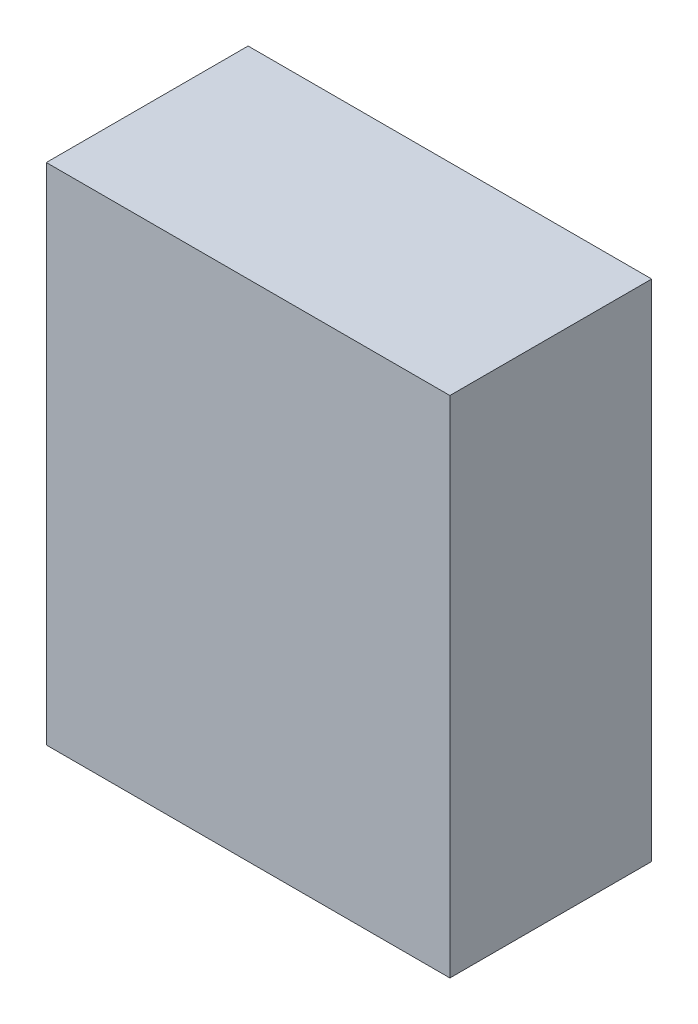
ISO-10303-21;
HEADER;
FILE_DESCRIPTION(('STEP AP214'),'2;1');
FILE_NAME('part.step','',(''),(''),'','','');
FILE_SCHEMA(('AUTOMOTIVE_DESIGN { 1 0 10303 214 1 1 1 1 }'));
ENDSEC;
DATA;
#1=APPLICATION_CONTEXT('core data for automotive mechanical design processes');
#2=APPLICATION_PROTOCOL_DEFINITION('international standard','automotive_design',2000,#1);
#3=PRODUCT_CONTEXT('',#1,'mechanical');
#4=PRODUCT('Part','Part','',(#3));
#5=PRODUCT_RELATED_PRODUCT_CATEGORY('part','',(#4));
#6=PRODUCT_DEFINITION_FORMATION('','',#4);
#7=PRODUCT_DEFINITION_CONTEXT('part definition',#1,'design');
#8=PRODUCT_DEFINITION('design','',#6,#7);
#9=PRODUCT_DEFINITION_SHAPE('','',#8);
#10=(LENGTH_UNIT() NAMED_UNIT(*) SI_UNIT(.MILLI.,.METRE.));
#11=(NAMED_UNIT(*) PLANE_ANGLE_UNIT() SI_UNIT($,.RADIAN.));
#12=(NAMED_UNIT(*) SI_UNIT($,.STERADIAN.) SOLID_ANGLE_UNIT());
#13=UNCERTAINTY_MEASURE_WITH_UNIT(LENGTH_MEASURE(1.E-05),#10,'distance_accuracy_value','');
#14=(GEOMETRIC_REPRESENTATION_CONTEXT(3) GLOBAL_UNCERTAINTY_ASSIGNED_CONTEXT((#13)) GLOBAL_UNIT_ASSIGNED_CONTEXT((#10,
#11,#12)) REPRESENTATION_CONTEXT('',''));
#15=CARTESIAN_POINT('',(0.,0.,0.));
#16=DIRECTION('',(0.,0.,1.));
#17=DIRECTION('',(1.,0.,0.));
#18=AXIS2_PLACEMENT_3D('',#15,#16,#17);
#19=CARTESIAN_POINT('',(400.,-500.,400.));
#20=DIRECTION('',(-1.,0.,0.));
#21=DIRECTION('',(0.,0.,1.));
#22=AXIS2_PLACEMENT_3D('',#19,#20,#21);
#23=PLANE('',#22);
#24=DIRECTION('',(0.,1.,0.));
#25=VECTOR('',#24,1.);
#26=CARTESIAN_POINT('',(400.,-500.,0.));
#27=LINE('',#26,#25);
#28=CARTESIAN_POINT('',(400.,-500.,0.));
#29=VERTEX_POINT('',#28);
#30=CARTESIAN_POINT('',(400.,500.,0.));
#31=VERTEX_POINT('',#30);
#32=EDGE_CURVE('E99',#29,#31,#27,.T.);
#33=ORIENTED_EDGE('',*,*,#32,.T.);
#34=DIRECTION('',(0.,0.,-1.));
#35=VECTOR('',#34,1.);
#36=CARTESIAN_POINT('',(400.,500.,400.));
#37=LINE('',#36,#35);
#38=CARTESIAN_POINT('',(400.,500.,400.));
#39=VERTEX_POINT('',#38);
#40=EDGE_CURVE('E11',#39,#31,#37,.T.);
#41=ORIENTED_EDGE('',*,*,#40,.F.);
#42=DIRECTION('',(0.,1.,0.));
#43=VECTOR('',#42,1.);
#44=CARTESIAN_POINT('',(400.,-500.,400.));
#45=LINE('',#44,#43);
#46=CARTESIAN_POINT('',(400.,-500.,400.));
#47=VERTEX_POINT('',#46);
#48=EDGE_CURVE('E87',#47,#39,#45,.T.);
#49=ORIENTED_EDGE('',*,*,#48,.F.);
#50=DIRECTION('',(0.,0.,-1.));
#51=VECTOR('',#50,1.);
#52=CARTESIAN_POINT('',(400.,-500.,400.));
#53=LINE('',#52,#51);
#54=EDGE_CURVE('E95',#47,#29,#53,.T.);
#55=ORIENTED_EDGE('',*,*,#54,.T.);
#56=EDGE_LOOP('',(#33,#41,#49,#55));
#57=FACE_BOUND('',#56,.T.);
#58=ADVANCED_FACE('F36',(#57),#23,.F.);
#59=CARTESIAN_POINT('',(-400.,500.,400.));
#60=DIRECTION('',(0.,-1.,0.));
#61=DIRECTION('',(0.,0.,-1.));
#62=AXIS2_PLACEMENT_3D('',#59,#60,#61);
#63=PLANE('',#62);
#64=DIRECTION('',(-1.,0.,0.));
#65=VECTOR('',#64,1.);
#66=CARTESIAN_POINT('',(-400.,500.,0.));
#67=LINE('',#66,#65);
#68=CARTESIAN_POINT('',(-400.,500.,0.));
#69=VERTEX_POINT('',#68);
#70=EDGE_CURVE('E91',#31,#69,#67,.T.);
#71=ORIENTED_EDGE('',*,*,#70,.T.);
#72=DIRECTION('',(0.,0.,-1.));
#73=VECTOR('',#72,1.);
#74=CARTESIAN_POINT('',(-400.,500.,400.));
#75=LINE('',#74,#73);
#76=CARTESIAN_POINT('',(-400.,500.,400.));
#77=VERTEX_POINT('',#76);
#78=EDGE_CURVE('E44',#77,#69,#75,.T.);
#79=ORIENTED_EDGE('',*,*,#78,.F.);
#80=DIRECTION('',(-1.,0.,0.));
#81=VECTOR('',#80,1.);
#82=CARTESIAN_POINT('',(-400.,500.,400.));
#83=LINE('',#82,#81);
#84=EDGE_CURVE('E82',#39,#77,#83,.T.);
#85=ORIENTED_EDGE('',*,*,#84,.F.);
#86=ORIENTED_EDGE('',*,*,#40,.T.);
#87=EDGE_LOOP('',(#71,#79,#85,#86));
#88=FACE_BOUND('',#87,.T.);
#89=ADVANCED_FACE('F90',(#88),#63,.F.);
#90=CARTESIAN_POINT('',(-400.,-500.,400.));
#91=DIRECTION('',(1.,0.,0.));
#92=DIRECTION('',(0.,0.,-1.));
#93=AXIS2_PLACEMENT_3D('',#90,#91,#92);
#94=PLANE('',#93);
#95=DIRECTION('',(0.,-1.,0.));
#96=VECTOR('',#95,1.);
#97=CARTESIAN_POINT('',(-400.,-500.,0.));
#98=LINE('',#97,#96);
#99=CARTESIAN_POINT('',(-400.,-500.,0.));
#100=VERTEX_POINT('',#99);
#101=EDGE_CURVE('E69',#69,#100,#98,.T.);
#102=ORIENTED_EDGE('',*,*,#101,.T.);
#103=DIRECTION('',(0.,0.,-1.));
#104=VECTOR('',#103,1.);
#105=CARTESIAN_POINT('',(-400.,-500.,400.));
#106=LINE('',#105,#104);
#107=CARTESIAN_POINT('',(-400.,-500.,400.));
#108=VERTEX_POINT('',#107);
#109=EDGE_CURVE('E92',#108,#100,#106,.T.);
#110=ORIENTED_EDGE('',*,*,#109,.F.);
#111=DIRECTION('',(0.,-1.,0.));
#112=VECTOR('',#111,1.);
#113=CARTESIAN_POINT('',(-400.,-500.,400.));
#114=LINE('',#113,#112);
#115=EDGE_CURVE('E85',#77,#108,#114,.T.);
#116=ORIENTED_EDGE('',*,*,#115,.F.);
#117=ORIENTED_EDGE('',*,*,#78,.T.);
#118=EDGE_LOOP('',(#102,#110,#116,#117));
#119=FACE_BOUND('',#118,.T.);
#120=ADVANCED_FACE('F93',(#119),#94,.F.);
#121=CARTESIAN_POINT('',(-400.,-500.,400.));
#122=DIRECTION('',(0.,1.,0.));
#123=DIRECTION('',(0.,0.,1.));
#124=AXIS2_PLACEMENT_3D('',#121,#122,#123);
#125=PLANE('',#124);
#126=DIRECTION('',(1.,0.,0.));
#127=VECTOR('',#126,1.);
#128=CARTESIAN_POINT('',(-400.,-500.,0.));
#129=LINE('',#128,#127);
#130=EDGE_CURVE('E75',#100,#29,#129,.T.);
#131=ORIENTED_EDGE('',*,*,#130,.T.);
#132=ORIENTED_EDGE('',*,*,#54,.F.);
#133=DIRECTION('',(1.,0.,0.));
#134=VECTOR('',#133,1.);
#135=CARTESIAN_POINT('',(-400.,-500.,400.));
#136=LINE('',#135,#134);
#137=EDGE_CURVE('E52',#108,#47,#136,.T.);
#138=ORIENTED_EDGE('',*,*,#137,.F.);
#139=ORIENTED_EDGE('',*,*,#109,.T.);
#140=EDGE_LOOP('',(#131,#132,#138,#139));
#141=FACE_BOUND('',#140,.T.);
#142=ADVANCED_FACE('F106',(#141),#125,.F.);
#143=CARTESIAN_POINT('',(0.,0.,400.));
#144=DIRECTION('',(0.,0.,-1.));
#145=DIRECTION('',(-1.,0.,0.));
#146=AXIS2_PLACEMENT_3D('',#143,#144,#145);
#147=PLANE('',#146);
#148=ORIENTED_EDGE('',*,*,#48,.T.);
#149=ORIENTED_EDGE('',*,*,#84,.T.);
#150=ORIENTED_EDGE('',*,*,#115,.T.);
#151=ORIENTED_EDGE('',*,*,#137,.T.);
#152=EDGE_LOOP('',(#148,#149,#150,#151));
#153=FACE_BOUND('',#152,.T.);
#154=ADVANCED_FACE('F83',(#153),#147,.F.);
#155=CARTESIAN_POINT('',(0.,0.,0.));
#156=DIRECTION('',(0.,0.,-1.));
#157=DIRECTION('',(-1.,0.,0.));
#158=AXIS2_PLACEMENT_3D('',#155,#156,#157);
#159=PLANE('',#158);
#160=ORIENTED_EDGE('',*,*,#32,.F.);
#161=ORIENTED_EDGE('',*,*,#130,.F.);
#162=ORIENTED_EDGE('',*,*,#101,.F.);
#163=ORIENTED_EDGE('',*,*,#70,.F.);
#164=EDGE_LOOP('',(#160,#161,#162,#163));
#165=FACE_BOUND('',#164,.T.);
#166=ADVANCED_FACE('F109',(#165),#159,.T.);
#167=CLOSED_SHELL('',(#58,#89,#120,#142,#154,#166));
#168=MANIFOLD_SOLID_BREP('B2',#167);
#169=ADVANCED_BREP_SHAPE_REPRESENTATION('',(#18,#168),#14);
#170=SHAPE_DEFINITION_REPRESENTATION(#9,#169);
ENDSEC;
END-ISO-10303-21;
